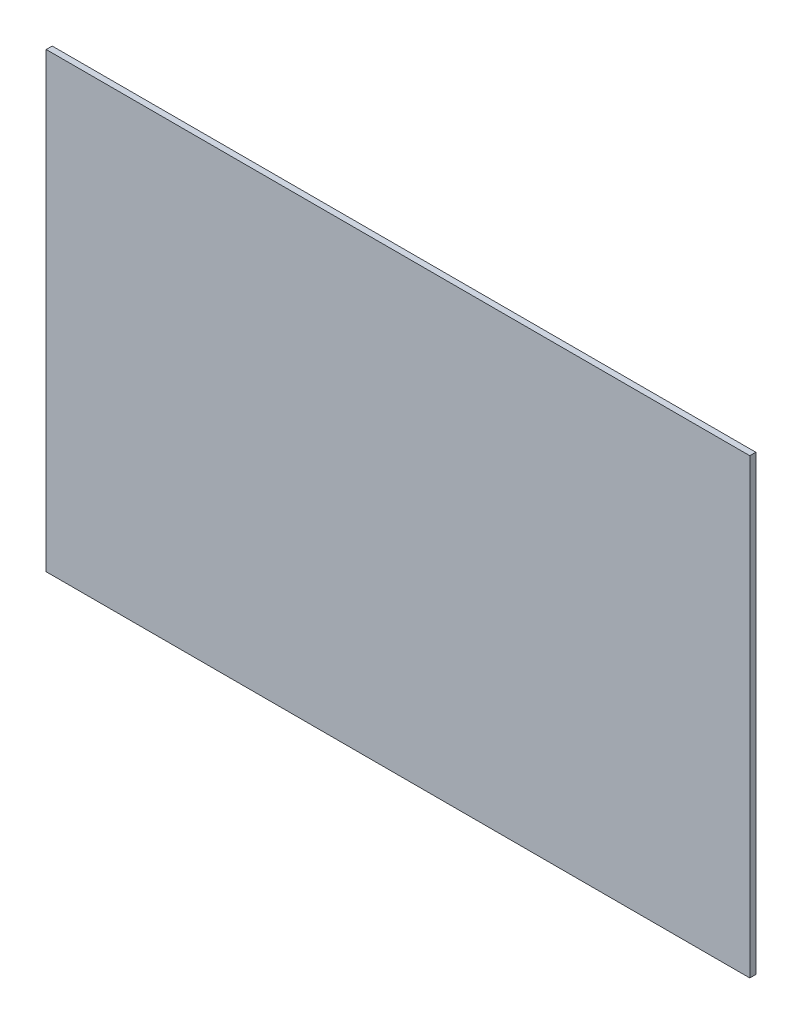
ISO-10303-21;
HEADER;
FILE_DESCRIPTION(('STEP AP214'),'2;1');
FILE_NAME('part.step','',(''),(''),'','','');
FILE_SCHEMA(('AUTOMOTIVE_DESIGN { 1 0 10303 214 1 1 1 1 }'));
ENDSEC;
DATA;
#1=APPLICATION_CONTEXT('core data for automotive mechanical design processes');
#2=APPLICATION_PROTOCOL_DEFINITION('international standard','automotive_design',2000,#1);
#3=PRODUCT_CONTEXT('',#1,'mechanical');
#4=PRODUCT('Part','Part','',(#3));
#5=PRODUCT_RELATED_PRODUCT_CATEGORY('part','',(#4));
#6=PRODUCT_DEFINITION_FORMATION('','',#4);
#7=PRODUCT_DEFINITION_CONTEXT('part definition',#1,'design');
#8=PRODUCT_DEFINITION('design','',#6,#7);
#9=PRODUCT_DEFINITION_SHAPE('','',#8);
#10=(LENGTH_UNIT() NAMED_UNIT(*) SI_UNIT(.MILLI.,.METRE.));
#11=(NAMED_UNIT(*) PLANE_ANGLE_UNIT() SI_UNIT($,.RADIAN.));
#12=(NAMED_UNIT(*) SI_UNIT($,.STERADIAN.) SOLID_ANGLE_UNIT());
#13=UNCERTAINTY_MEASURE_WITH_UNIT(LENGTH_MEASURE(1.E-05),#10,'distance_accuracy_value','');
#14=(GEOMETRIC_REPRESENTATION_CONTEXT(3) GLOBAL_UNCERTAINTY_ASSIGNED_CONTEXT((#13)) GLOBAL_UNIT_ASSIGNED_CONTEXT((#10,
#11,#12)) REPRESENTATION_CONTEXT('',''));
#15=CARTESIAN_POINT('',(0.,0.,0.));
#16=DIRECTION('',(0.,0.,1.));
#17=DIRECTION('',(1.,0.,0.));
#18=AXIS2_PLACEMENT_3D('',#15,#16,#17);
#19=CARTESIAN_POINT('',(-140.,90.,2.4));
#20=DIRECTION('',(1.,0.,0.));
#21=DIRECTION('',(0.,0.,-1.));
#22=AXIS2_PLACEMENT_3D('',#19,#20,#21);
#23=PLANE('',#22);
#24=DIRECTION('',(0.,-1.,0.));
#25=VECTOR('',#24,1.);
#26=CARTESIAN_POINT('',(-140.,90.,0.));
#27=LINE('',#26,#25);
#28=CARTESIAN_POINT('',(-140.,90.,0.));
#29=VERTEX_POINT('',#28);
#30=CARTESIAN_POINT('',(-140.,-90.,0.));
#31=VERTEX_POINT('',#30);
#32=EDGE_CURVE('E96',#29,#31,#27,.T.);
#33=ORIENTED_EDGE('',*,*,#32,.T.);
#34=DIRECTION('',(0.,0.,-1.));
#35=VECTOR('',#34,1.);
#36=CARTESIAN_POINT('',(-140.,-90.,2.4));
#37=LINE('',#36,#35);
#38=CARTESIAN_POINT('',(-140.,-90.,2.4));
#39=VERTEX_POINT('',#38);
#40=EDGE_CURVE('E11',#39,#31,#37,.T.);
#41=ORIENTED_EDGE('',*,*,#40,.F.);
#42=DIRECTION('',(0.,-1.,0.));
#43=VECTOR('',#42,1.);
#44=CARTESIAN_POINT('',(-140.,90.,2.4));
#45=LINE('',#44,#43);
#46=CARTESIAN_POINT('',(-140.,90.,2.4));
#47=VERTEX_POINT('',#46);
#48=EDGE_CURVE('E84',#47,#39,#45,.T.);
#49=ORIENTED_EDGE('',*,*,#48,.F.);
#50=DIRECTION('',(0.,0.,-1.));
#51=VECTOR('',#50,1.);
#52=CARTESIAN_POINT('',(-140.,90.,2.4));
#53=LINE('',#52,#51);
#54=EDGE_CURVE('E92',#47,#29,#53,.T.);
#55=ORIENTED_EDGE('',*,*,#54,.T.);
#56=EDGE_LOOP('',(#33,#41,#49,#55));
#57=FACE_BOUND('',#56,.T.);
#58=ADVANCED_FACE('F33',(#57),#23,.F.);
#59=CARTESIAN_POINT('',(140.,-90.,2.4));
#60=DIRECTION('',(0.,1.,0.));
#61=DIRECTION('',(-1.,0.,0.));
#62=AXIS2_PLACEMENT_3D('',#59,#60,#61);
#63=PLANE('',#62);
#64=DIRECTION('',(1.,0.,0.));
#65=VECTOR('',#64,1.);
#66=CARTESIAN_POINT('',(140.,-90.,0.));
#67=LINE('',#66,#65);
#68=CARTESIAN_POINT('',(140.,-90.,0.));
#69=VERTEX_POINT('',#68);
#70=EDGE_CURVE('E88',#31,#69,#67,.T.);
#71=ORIENTED_EDGE('',*,*,#70,.T.);
#72=DIRECTION('',(0.,0.,-1.));
#73=VECTOR('',#72,1.);
#74=CARTESIAN_POINT('',(140.,-90.,2.4));
#75=LINE('',#74,#73);
#76=CARTESIAN_POINT('',(140.,-90.,2.4));
#77=VERTEX_POINT('',#76);
#78=EDGE_CURVE('E41',#77,#69,#75,.T.);
#79=ORIENTED_EDGE('',*,*,#78,.F.);
#80=DIRECTION('',(1.,0.,0.));
#81=VECTOR('',#80,1.);
#82=CARTESIAN_POINT('',(140.,-90.,2.4));
#83=LINE('',#82,#81);
#84=EDGE_CURVE('E79',#39,#77,#83,.T.);
#85=ORIENTED_EDGE('',*,*,#84,.F.);
#86=ORIENTED_EDGE('',*,*,#40,.T.);
#87=EDGE_LOOP('',(#71,#79,#85,#86));
#88=FACE_BOUND('',#87,.T.);
#89=ADVANCED_FACE('F87',(#88),#63,.F.);
#90=CARTESIAN_POINT('',(140.,90.,2.4));
#91=DIRECTION('',(-1.,0.,0.));
#92=DIRECTION('',(0.,-1.,0.));
#93=AXIS2_PLACEMENT_3D('',#90,#91,#92);
#94=PLANE('',#93);
#95=DIRECTION('',(0.,1.,0.));
#96=VECTOR('',#95,1.);
#97=CARTESIAN_POINT('',(140.,90.,0.));
#98=LINE('',#97,#96);
#99=CARTESIAN_POINT('',(140.,90.,0.));
#100=VERTEX_POINT('',#99);
#101=EDGE_CURVE('E66',#69,#100,#98,.T.);
#102=ORIENTED_EDGE('',*,*,#101,.T.);
#103=DIRECTION('',(0.,0.,-1.));
#104=VECTOR('',#103,1.);
#105=CARTESIAN_POINT('',(140.,90.,2.4));
#106=LINE('',#105,#104);
#107=CARTESIAN_POINT('',(140.,90.,2.4));
#108=VERTEX_POINT('',#107);
#109=EDGE_CURVE('E89',#108,#100,#106,.T.);
#110=ORIENTED_EDGE('',*,*,#109,.F.);
#111=DIRECTION('',(0.,1.,0.));
#112=VECTOR('',#111,1.);
#113=CARTESIAN_POINT('',(140.,90.,2.4));
#114=LINE('',#113,#112);
#115=EDGE_CURVE('E82',#77,#108,#114,.T.);
#116=ORIENTED_EDGE('',*,*,#115,.F.);
#117=ORIENTED_EDGE('',*,*,#78,.T.);
#118=EDGE_LOOP('',(#102,#110,#116,#117));
#119=FACE_BOUND('',#118,.T.);
#120=ADVANCED_FACE('F90',(#119),#94,.F.);
#121=CARTESIAN_POINT('',(140.,90.,2.4));
#122=DIRECTION('',(0.,-1.,0.));
#123=DIRECTION('',(1.,0.,0.));
#124=AXIS2_PLACEMENT_3D('',#121,#122,#123);
#125=PLANE('',#124);
#126=DIRECTION('',(-1.,0.,0.));
#127=VECTOR('',#126,1.);
#128=CARTESIAN_POINT('',(140.,90.,0.));
#129=LINE('',#128,#127);
#130=EDGE_CURVE('E72',#100,#29,#129,.T.);
#131=ORIENTED_EDGE('',*,*,#130,.T.);
#132=ORIENTED_EDGE('',*,*,#54,.F.);
#133=DIRECTION('',(-1.,0.,0.));
#134=VECTOR('',#133,1.);
#135=CARTESIAN_POINT('',(140.,90.,2.4));
#136=LINE('',#135,#134);
#137=EDGE_CURVE('E49',#108,#47,#136,.T.);
#138=ORIENTED_EDGE('',*,*,#137,.F.);
#139=ORIENTED_EDGE('',*,*,#109,.T.);
#140=EDGE_LOOP('',(#131,#132,#138,#139));
#141=FACE_BOUND('',#140,.T.);
#142=ADVANCED_FACE('F103',(#141),#125,.F.);
#143=CARTESIAN_POINT('',(0.,0.,2.4));
#144=DIRECTION('',(0.,0.,-1.));
#145=DIRECTION('',(-1.,0.,0.));
#146=AXIS2_PLACEMENT_3D('',#143,#144,#145);
#147=PLANE('',#146);
#148=ORIENTED_EDGE('',*,*,#48,.T.);
#149=ORIENTED_EDGE('',*,*,#84,.T.);
#150=ORIENTED_EDGE('',*,*,#115,.T.);
#151=ORIENTED_EDGE('',*,*,#137,.T.);
#152=EDGE_LOOP('',(#148,#149,#150,#151));
#153=FACE_BOUND('',#152,.T.);
#154=ADVANCED_FACE('F80',(#153),#147,.F.);
#155=CARTESIAN_POINT('',(0.,0.,0.));
#156=DIRECTION('',(0.,0.,-1.));
#157=DIRECTION('',(-1.,0.,0.));
#158=AXIS2_PLACEMENT_3D('',#155,#156,#157);
#159=PLANE('',#158);
#160=ORIENTED_EDGE('',*,*,#32,.F.);
#161=ORIENTED_EDGE('',*,*,#130,.F.);
#162=ORIENTED_EDGE('',*,*,#101,.F.);
#163=ORIENTED_EDGE('',*,*,#70,.F.);
#164=EDGE_LOOP('',(#160,#161,#162,#163));
#165=FACE_BOUND('',#164,.T.);
#166=ADVANCED_FACE('F106',(#165),#159,.T.);
#167=CLOSED_SHELL('',(#58,#89,#120,#142,#154,#166));
#168=MANIFOLD_SOLID_BREP('B2',#167);
#169=ADVANCED_BREP_SHAPE_REPRESENTATION('',(#18,#168),#14);
#170=SHAPE_DEFINITION_REPRESENTATION(#9,#169);
ENDSEC;
END-ISO-10303-21;
